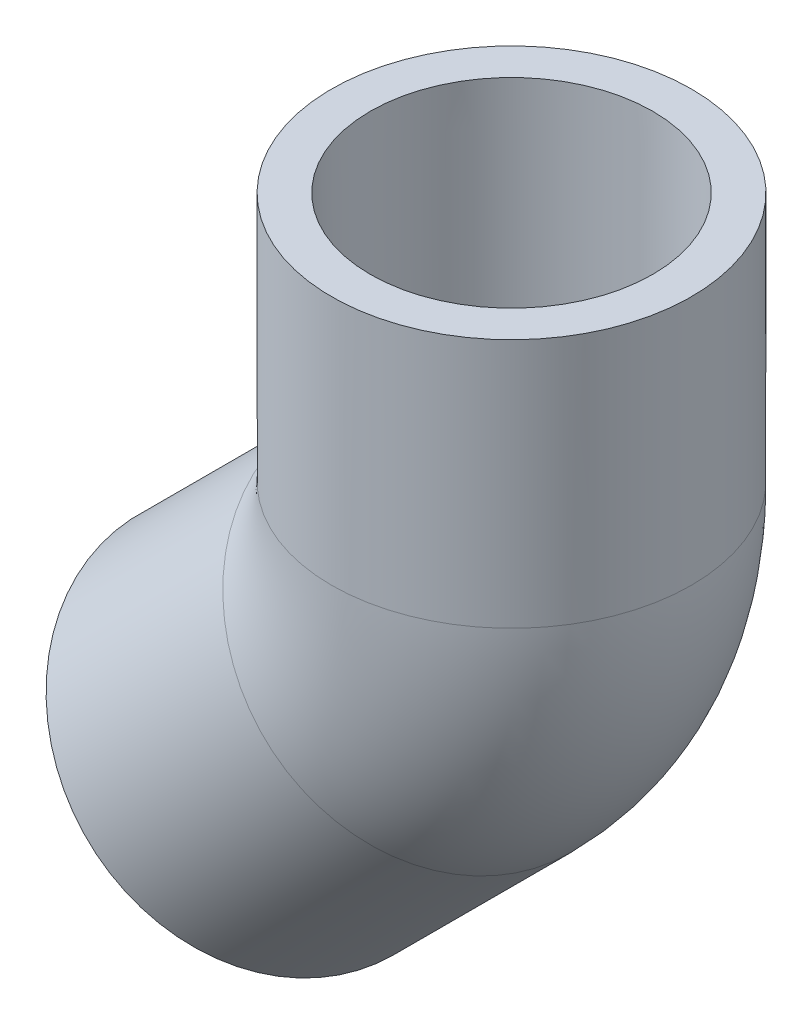
ISO-10303-21;
HEADER;
FILE_DESCRIPTION(('STEP AP214'),'2;1');
FILE_NAME('part.step','',(''),(''),'','','');
FILE_SCHEMA(('AUTOMOTIVE_DESIGN { 1 0 10303 214 1 1 1 1 }'));
ENDSEC;
DATA;
#1=APPLICATION_CONTEXT('core data for automotive mechanical design processes');
#2=APPLICATION_PROTOCOL_DEFINITION('international standard','automotive_design',2000,#1);
#3=PRODUCT_CONTEXT('',#1,'mechanical');
#4=PRODUCT('Part','Part','',(#3));
#5=PRODUCT_RELATED_PRODUCT_CATEGORY('part','',(#4));
#6=PRODUCT_DEFINITION_FORMATION('','',#4);
#7=PRODUCT_DEFINITION_CONTEXT('part definition',#1,'design');
#8=PRODUCT_DEFINITION('design','',#6,#7);
#9=PRODUCT_DEFINITION_SHAPE('','',#8);
#10=(LENGTH_UNIT() NAMED_UNIT(*) SI_UNIT(.MILLI.,.METRE.));
#11=(NAMED_UNIT(*) PLANE_ANGLE_UNIT() SI_UNIT($,.RADIAN.));
#12=(NAMED_UNIT(*) SI_UNIT($,.STERADIAN.) SOLID_ANGLE_UNIT());
#13=UNCERTAINTY_MEASURE_WITH_UNIT(LENGTH_MEASURE(1.E-05),#10,'distance_accuracy_value','');
#14=(GEOMETRIC_REPRESENTATION_CONTEXT(3) GLOBAL_UNCERTAINTY_ASSIGNED_CONTEXT((#13)) GLOBAL_UNIT_ASSIGNED_CONTEXT((#10,
#11,#12)) REPRESENTATION_CONTEXT('',''));
#15=CARTESIAN_POINT('',(0.,0.,0.));
#16=DIRECTION('',(0.,0.,1.));
#17=DIRECTION('',(1.,0.,0.));
#18=AXIS2_PLACEMENT_3D('',#15,#16,#17);
#19=CARTESIAN_POINT('',(-8.9802561210692,-28.3776093425785,0.));
#20=DIRECTION('',(-0.707106781186549,-0.707106781186546,0.));
#21=DIRECTION('',(0.707106781186546,-0.707106781186549,0.));
#22=AXIS2_PLACEMENT_3D('',#19,#20,#21);
#23=PLANE('',#22);
#24=CARTESIAN_POINT('',(-18.6789327318239,-18.6789327318238,0.));
#25=DIRECTION('',(-0.707106781186549,-0.707106781186546,0.));
#26=DIRECTION('',(0.707106781186546,-0.707106781186549,0.));
#27=AXIS2_PLACEMENT_3D('',#24,#25,#26);
#28=CIRCLE('',#27,13.716);
#29=CARTESIAN_POINT('',(-8.9802561210692,-28.3776093425785,0.));
#30=VERTEX_POINT('',#29);
#31=EDGE_CURVE('E51',#30,#30,#28,.T.);
#32=ORIENTED_EDGE('',*,*,#31,.T.);
#33=EDGE_LOOP('',(#32));
#34=FACE_BOUND('',#33,.T.);
#35=CARTESIAN_POINT('',(-18.6789327318239,-18.6789327318238,0.));
#36=DIRECTION('',(-0.707106781186549,-0.707106781186546,0.));
#37=DIRECTION('',(0.707106781186546,-0.707106781186549,0.));
#38=AXIS2_PLACEMENT_3D('',#35,#36,#37);
#39=CIRCLE('',#38,10.7696);
#40=CARTESIAN_POINT('',(-11.0636755411572,-26.2941899224905,0.));
#41=VERTEX_POINT('',#40);
#42=EDGE_CURVE('E38',#41,#41,#39,.T.);
#43=ORIENTED_EDGE('',*,*,#42,.F.);
#44=EDGE_LOOP('',(#43));
#45=FACE_BOUND('',#44,.T.);
#46=ADVANCED_FACE('F32',(#34,#45),#23,.T.);
#47=CARTESIAN_POINT('',(-5.20854855022012,-5.2085485502201,0.));
#48=DIRECTION('',(-0.707106781186549,-0.707106781186546,0.));
#49=DIRECTION('',(0.707106781186546,-0.707106781186549,0.));
#50=AXIS2_PLACEMENT_3D('',#47,#48,#49);
#51=CONICAL_SURFACE('',#50,10.6172,0.00799982933988657);
#52=ORIENTED_EDGE('',*,*,#42,.T.);
#53=EDGE_LOOP('',(#52));
#54=FACE_BOUND('',#53,.T.);
#55=CARTESIAN_POINT('',(-5.20854855022012,-5.2085485502201,0.));
#56=DIRECTION('',(-0.707106781186549,-0.707106781186546,0.));
#57=DIRECTION('',(0.707106781186546,-0.707106781186549,0.));
#58=AXIS2_PLACEMENT_3D('',#55,#56,#57);
#59=CIRCLE('',#58,10.6172);
#60=CARTESIAN_POINT('',(2.29894556699368,-12.7160426674339,0.));
#61=VERTEX_POINT('',#60);
#62=EDGE_CURVE('E42',#61,#61,#59,.T.);
#63=ORIENTED_EDGE('',*,*,#62,.F.);
#64=EDGE_LOOP('',(#63));
#65=FACE_BOUND('',#64,.T.);
#66=ADVANCED_FACE('F83',(#54,#65),#51,.F.);
#67=CARTESIAN_POINT('',(-18.6789327318239,-18.6789327318238,0.));
#68=DIRECTION('',(-0.707106781186549,-0.707106781186546,0.));
#69=DIRECTION('',(0.707106781186546,-0.707106781186549,0.));
#70=AXIS2_PLACEMENT_3D('',#67,#68,#69);
#71=CYLINDRICAL_SURFACE('',#70,13.716);
#72=CARTESIAN_POINT('',(-5.20854855022012,-5.2085485502201,0.));
#73=DIRECTION('',(-0.707106781186549,-0.707106781186546,0.));
#74=DIRECTION('',(0.707106781186546,-0.707106781186549,0.));
#75=AXIS2_PLACEMENT_3D('',#72,#73,#74);
#76=CIRCLE('',#75,13.716);
#77=CARTESIAN_POINT('',(4.49012806053456,-14.9072251609748,0.));
#78=VERTEX_POINT('',#77);
#79=EDGE_CURVE('E46',#78,#78,#76,.T.);
#80=ORIENTED_EDGE('',*,*,#79,.T.);
#81=EDGE_LOOP('',(#80));
#82=FACE_BOUND('',#81,.T.);
#83=ORIENTED_EDGE('',*,*,#31,.F.);
#84=EDGE_LOOP('',(#83));
#85=FACE_BOUND('',#84,.T.);
#86=ADVANCED_FACE('F88',(#82,#85),#71,.T.);
#87=CARTESIAN_POINT('',(-17.7830971004402,7.366,0.));
#88=DIRECTION('',(0.,0.,-1.));
#89=DIRECTION('',(-1.,0.,0.));
#90=AXIS2_PLACEMENT_3D('',#87,#88,#89);
#91=TOROIDAL_SURFACE('',#90,17.7830971004402,7.89939999999997);
#92=CARTESIAN_POINT('',(0.,7.366,0.));
#93=DIRECTION('',(0.,1.,0.));
#94=DIRECTION('',(-1.,0.,0.));
#95=AXIS2_PLACEMENT_3D('',#92,#93,#94);
#96=CIRCLE('',#95,7.89939999999997);
#97=CARTESIAN_POINT('',(7.89939999999997,7.36600000000001,0.));
#98=VERTEX_POINT('',#97);
#99=EDGE_CURVE('E57',#98,#98,#96,.T.);
#100=CARTESIAN_POINT('',(-5.20854855022012,-5.2085485502201,0.));
#101=DIRECTION('',(0.707106781186549,0.707106781186546,0.));
#102=DIRECTION('',(-0.707106781186546,0.707106781186549,0.));
#103=AXIS2_PLACEMENT_3D('',#100,#101,#102);
#104=CIRCLE('',#103,7.89939999999997);
#105=CARTESIAN_POINT('',(0.37717075708487,-10.7942678575251,0.));
#106=VERTEX_POINT('',#105);
#107=EDGE_CURVE('E60',#106,#106,#104,.T.);
#108=CARTESIAN_POINT('',(-17.7830971004402,7.366,0.));
#109=DIRECTION('',(0.,0.,-1.));
#110=DIRECTION('',(-1.,0.,0.));
#111=AXIS2_PLACEMENT_3D('',#108,#109,#110);
#112=CIRCLE('',#111,25.6824971004401);
#113=EDGE_CURVE('',#98,#106,#112,.T.);
#114=ORIENTED_EDGE('',*,*,#99,.T.);
#115=ORIENTED_EDGE('',*,*,#107,.F.);
#116=ORIENTED_EDGE('',*,*,#113,.T.);
#117=ORIENTED_EDGE('',*,*,#113,.F.);
#118=EDGE_LOOP('',(#114,#116,#115,#117));
#119=FACE_BOUND('',#118,.T.);
#120=ADVANCED_FACE('F93',(#119),#91,.F.);
#121=CARTESIAN_POINT('',(-17.7830971004402,7.366,0.));
#122=DIRECTION('',(0.,0.,-1.));
#123=DIRECTION('',(-1.,0.,0.));
#124=AXIS2_PLACEMENT_3D('',#121,#122,#123);
#125=TOROIDAL_SURFACE('',#124,17.7830971004402,13.716);
#126=CARTESIAN_POINT('',(0.,7.366,0.));
#127=DIRECTION('',(0.,1.,0.));
#128=DIRECTION('',(-1.,0.,0.));
#129=AXIS2_PLACEMENT_3D('',#126,#127,#128);
#130=CIRCLE('',#129,13.716);
#131=CARTESIAN_POINT('',(13.716,7.36600000000001,0.));
#132=VERTEX_POINT('',#131);
#133=EDGE_CURVE('E54',#132,#132,#130,.T.);
#134=CARTESIAN_POINT('',(-17.7830971004402,7.366,0.));
#135=DIRECTION('',(0.,0.,-1.));
#136=DIRECTION('',(-1.,0.,0.));
#137=AXIS2_PLACEMENT_3D('',#134,#135,#136);
#138=CIRCLE('',#137,31.4990971004402);
#139=EDGE_CURVE('',#132,#78,#138,.T.);
#140=ORIENTED_EDGE('',*,*,#133,.F.);
#141=ORIENTED_EDGE('',*,*,#79,.F.);
#142=ORIENTED_EDGE('',*,*,#139,.T.);
#143=ORIENTED_EDGE('',*,*,#139,.F.);
#144=EDGE_LOOP('',(#140,#142,#141,#143));
#145=FACE_BOUND('',#144,.T.);
#146=ADVANCED_FACE('F99',(#145),#125,.T.);
#147=CARTESIAN_POINT('',(0.,7.366,0.));
#148=DIRECTION('',(0.,1.,0.));
#149=DIRECTION('',(-1.,0.,0.));
#150=AXIS2_PLACEMENT_3D('',#147,#148,#149);
#151=PLANE('',#150);
#152=CARTESIAN_POINT('',(0.,7.366,0.));
#153=DIRECTION('',(0.,1.,0.));
#154=DIRECTION('',(-1.,0.,0.));
#155=AXIS2_PLACEMENT_3D('',#152,#153,#154);
#156=CIRCLE('',#155,10.6172);
#157=CARTESIAN_POINT('',(-10.6172,7.366,0.));
#158=VERTEX_POINT('',#157);
#159=EDGE_CURVE('E10',#158,#158,#156,.F.);
#160=ORIENTED_EDGE('',*,*,#159,.F.);
#161=EDGE_LOOP('',(#160));
#162=FACE_BOUND('',#161,.T.);
#163=ORIENTED_EDGE('',*,*,#99,.F.);
#164=EDGE_LOOP('',(#163));
#165=FACE_BOUND('',#164,.T.);
#166=ADVANCED_FACE('F102',(#162,#165),#151,.T.);
#167=CARTESIAN_POINT('',(-5.20854855022012,-5.2085485502201,0.));
#168=DIRECTION('',(0.707106781186549,0.707106781186546,0.));
#169=DIRECTION('',(-0.707106781186546,0.707106781186549,0.));
#170=AXIS2_PLACEMENT_3D('',#167,#168,#169);
#171=PLANE('',#170);
#172=ORIENTED_EDGE('',*,*,#62,.T.);
#173=EDGE_LOOP('',(#172));
#174=FACE_BOUND('',#173,.T.);
#175=ORIENTED_EDGE('',*,*,#107,.T.);
#176=EDGE_LOOP('',(#175));
#177=FACE_BOUND('',#176,.T.);
#178=ADVANCED_FACE('F106',(#174,#177),#171,.F.);
#179=CARTESIAN_POINT('',(13.716,26.416,0.));
#180=DIRECTION('',(0.,1.,0.));
#181=DIRECTION('',(0.,0.,1.));
#182=AXIS2_PLACEMENT_3D('',#179,#180,#181);
#183=PLANE('',#182);
#184=CARTESIAN_POINT('',(0.,26.416,0.));
#185=DIRECTION('',(0.,-1.,0.));
#186=DIRECTION('',(0.,0.,-1.));
#187=AXIS2_PLACEMENT_3D('',#184,#185,#186);
#188=CIRCLE('',#187,10.7696);
#189=CARTESIAN_POINT('',(0.,26.416,-10.7696));
#190=VERTEX_POINT('',#189);
#191=EDGE_CURVE('E66',#190,#190,#188,.T.);
#192=ORIENTED_EDGE('',*,*,#191,.T.);
#193=EDGE_LOOP('',(#192));
#194=FACE_BOUND('',#193,.T.);
#195=CARTESIAN_POINT('',(0.,26.416,0.));
#196=DIRECTION('',(0.,-1.,0.));
#197=DIRECTION('',(0.,0.,-1.));
#198=AXIS2_PLACEMENT_3D('',#195,#196,#197);
#199=CIRCLE('',#198,13.716);
#200=CARTESIAN_POINT('',(0.,26.416,-13.716));
#201=VERTEX_POINT('',#200);
#202=EDGE_CURVE('E63',#201,#201,#199,.T.);
#203=ORIENTED_EDGE('',*,*,#202,.F.);
#204=EDGE_LOOP('',(#203));
#205=FACE_BOUND('',#204,.T.);
#206=ADVANCED_FACE('F70',(#194,#205),#183,.T.);
#207=CARTESIAN_POINT('',(0.,0.,0.));
#208=DIRECTION('',(0.,-1.,0.));
#209=DIRECTION('',(0.,0.,-1.));
#210=AXIS2_PLACEMENT_3D('',#207,#208,#209);
#211=CYLINDRICAL_SURFACE('',#210,13.716);
#212=ORIENTED_EDGE('',*,*,#202,.T.);
#213=EDGE_LOOP('',(#212));
#214=FACE_BOUND('',#213,.T.);
#215=ORIENTED_EDGE('',*,*,#133,.T.);
#216=EDGE_LOOP('',(#215));
#217=FACE_BOUND('',#216,.T.);
#218=ADVANCED_FACE('F75',(#214,#217),#211,.T.);
#219=CARTESIAN_POINT('',(0.,26.416,0.));
#220=DIRECTION('',(0.,1.,0.));
#221=DIRECTION('',(0.,0.,1.));
#222=AXIS2_PLACEMENT_3D('',#219,#220,#221);
#223=CONICAL_SURFACE('',#222,10.7696,0.00799982933988666);
#224=ORIENTED_EDGE('',*,*,#159,.T.);
#225=EDGE_LOOP('',(#224));
#226=FACE_BOUND('',#225,.T.);
#227=ORIENTED_EDGE('',*,*,#191,.F.);
#228=EDGE_LOOP('',(#227));
#229=FACE_BOUND('',#228,.T.);
#230=ADVANCED_FACE('F73',(#226,#229),#223,.F.);
#231=CLOSED_SHELL('',(#46,#66,#86,#120,#146,#166,#178,#206,#218,#230));
#232=MANIFOLD_SOLID_BREP('B2',#231);
#233=ADVANCED_BREP_SHAPE_REPRESENTATION('',(#18,#232),#14);
#234=SHAPE_DEFINITION_REPRESENTATION(#9,#233);
ENDSEC;
END-ISO-10303-21;
